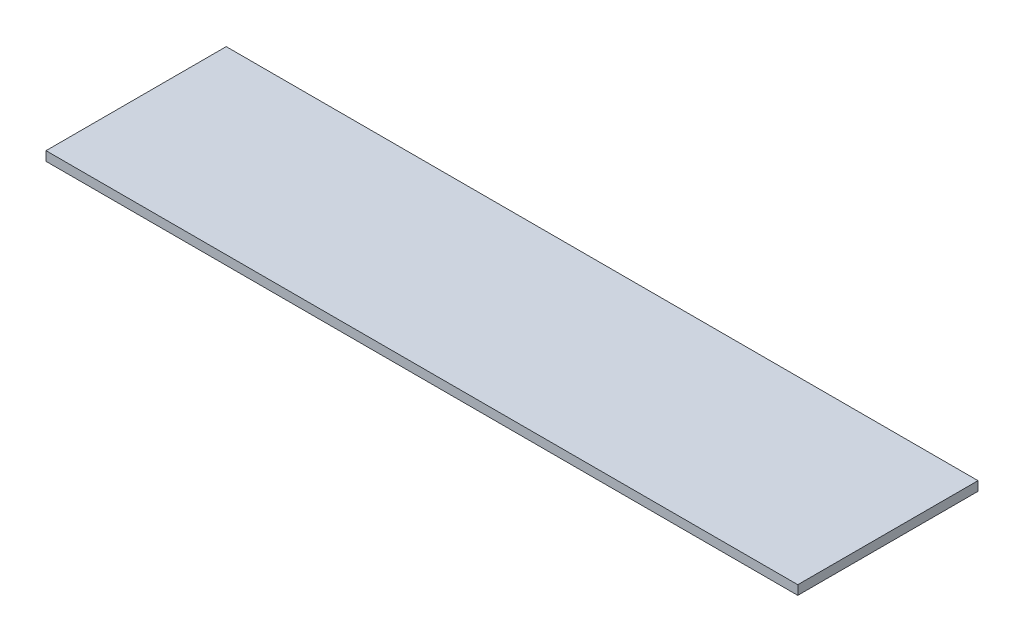
ISO-10303-21;
HEADER;
FILE_DESCRIPTION(('STEP AP214'),'2;1');
FILE_NAME('part.step','',(''),(''),'','','');
FILE_SCHEMA(('AUTOMOTIVE_DESIGN { 1 0 10303 214 1 1 1 1 }'));
ENDSEC;
DATA;
#1=APPLICATION_CONTEXT('core data for automotive mechanical design processes');
#2=APPLICATION_PROTOCOL_DEFINITION('international standard','automotive_design',2000,#1);
#3=PRODUCT_CONTEXT('',#1,'mechanical');
#4=PRODUCT('Part','Part','',(#3));
#5=PRODUCT_RELATED_PRODUCT_CATEGORY('part','',(#4));
#6=PRODUCT_DEFINITION_FORMATION('','',#4);
#7=PRODUCT_DEFINITION_CONTEXT('part definition',#1,'design');
#8=PRODUCT_DEFINITION('design','',#6,#7);
#9=PRODUCT_DEFINITION_SHAPE('','',#8);
#10=(LENGTH_UNIT() NAMED_UNIT(*) SI_UNIT(.MILLI.,.METRE.));
#11=(NAMED_UNIT(*) PLANE_ANGLE_UNIT() SI_UNIT($,.RADIAN.));
#12=(NAMED_UNIT(*) SI_UNIT($,.STERADIAN.) SOLID_ANGLE_UNIT());
#13=UNCERTAINTY_MEASURE_WITH_UNIT(LENGTH_MEASURE(1.E-05),#10,'distance_accuracy_value','');
#14=(GEOMETRIC_REPRESENTATION_CONTEXT(3) GLOBAL_UNCERTAINTY_ASSIGNED_CONTEXT((#13)) GLOBAL_UNIT_ASSIGNED_CONTEXT((#10,
#11,#12)) REPRESENTATION_CONTEXT('',''));
#15=CARTESIAN_POINT('',(0.,0.,0.));
#16=DIRECTION('',(0.,0.,1.));
#17=DIRECTION('',(1.,0.,0.));
#18=AXIS2_PLACEMENT_3D('',#15,#16,#17);
#19=CARTESIAN_POINT('',(730.,18.,-175.));
#20=DIRECTION('',(-1.,0.,0.));
#21=DIRECTION('',(0.,0.,1.));
#22=AXIS2_PLACEMENT_3D('',#19,#20,#21);
#23=PLANE('',#22);
#24=DIRECTION('',(0.,0.,-1.));
#25=VECTOR('',#24,1.);
#26=CARTESIAN_POINT('',(730.,0.,-175.));
#27=LINE('',#26,#25);
#28=CARTESIAN_POINT('',(730.,0.,175.));
#29=VERTEX_POINT('',#28);
#30=CARTESIAN_POINT('',(730.,0.,-175.));
#31=VERTEX_POINT('',#30);
#32=EDGE_CURVE('E97',#29,#31,#27,.T.);
#33=ORIENTED_EDGE('',*,*,#32,.T.);
#34=DIRECTION('',(0.,-1.,0.));
#35=VECTOR('',#34,1.);
#36=CARTESIAN_POINT('',(730.,18.,-175.));
#37=LINE('',#36,#35);
#38=CARTESIAN_POINT('',(730.,18.,-175.));
#39=VERTEX_POINT('',#38);
#40=EDGE_CURVE('E11',#39,#31,#37,.T.);
#41=ORIENTED_EDGE('',*,*,#40,.F.);
#42=DIRECTION('',(0.,0.,-1.));
#43=VECTOR('',#42,1.);
#44=CARTESIAN_POINT('',(730.,18.,-175.));
#45=LINE('',#44,#43);
#46=CARTESIAN_POINT('',(730.,18.,175.));
#47=VERTEX_POINT('',#46);
#48=EDGE_CURVE('E85',#47,#39,#45,.T.);
#49=ORIENTED_EDGE('',*,*,#48,.F.);
#50=DIRECTION('',(0.,-1.,0.));
#51=VECTOR('',#50,1.);
#52=CARTESIAN_POINT('',(730.,18.,175.));
#53=LINE('',#52,#51);
#54=EDGE_CURVE('E93',#47,#29,#53,.T.);
#55=ORIENTED_EDGE('',*,*,#54,.T.);
#56=EDGE_LOOP('',(#33,#41,#49,#55));
#57=FACE_BOUND('',#56,.T.);
#58=ADVANCED_FACE('F34',(#57),#23,.F.);
#59=CARTESIAN_POINT('',(-730.,18.,-175.));
#60=DIRECTION('',(0.,0.,1.));
#61=DIRECTION('',(1.,0.,0.));
#62=AXIS2_PLACEMENT_3D('',#59,#60,#61);
#63=PLANE('',#62);
#64=DIRECTION('',(-1.,0.,0.));
#65=VECTOR('',#64,1.);
#66=CARTESIAN_POINT('',(-730.,0.,-175.));
#67=LINE('',#66,#65);
#68=CARTESIAN_POINT('',(-730.,0.,-175.));
#69=VERTEX_POINT('',#68);
#70=EDGE_CURVE('E89',#31,#69,#67,.T.);
#71=ORIENTED_EDGE('',*,*,#70,.T.);
#72=DIRECTION('',(0.,-1.,0.));
#73=VECTOR('',#72,1.);
#74=CARTESIAN_POINT('',(-730.,18.,-175.));
#75=LINE('',#74,#73);
#76=CARTESIAN_POINT('',(-730.,18.,-175.));
#77=VERTEX_POINT('',#76);
#78=EDGE_CURVE('E42',#77,#69,#75,.T.);
#79=ORIENTED_EDGE('',*,*,#78,.F.);
#80=DIRECTION('',(-1.,0.,0.));
#81=VECTOR('',#80,1.);
#82=CARTESIAN_POINT('',(-730.,18.,-175.));
#83=LINE('',#82,#81);
#84=EDGE_CURVE('E80',#39,#77,#83,.T.);
#85=ORIENTED_EDGE('',*,*,#84,.F.);
#86=ORIENTED_EDGE('',*,*,#40,.T.);
#87=EDGE_LOOP('',(#71,#79,#85,#86));
#88=FACE_BOUND('',#87,.T.);
#89=ADVANCED_FACE('F88',(#88),#63,.F.);
#90=CARTESIAN_POINT('',(-730.,18.,-175.));
#91=DIRECTION('',(1.,0.,0.));
#92=DIRECTION('',(0.,0.,-1.));
#93=AXIS2_PLACEMENT_3D('',#90,#91,#92);
#94=PLANE('',#93);
#95=DIRECTION('',(0.,0.,1.));
#96=VECTOR('',#95,1.);
#97=CARTESIAN_POINT('',(-730.,0.,-175.));
#98=LINE('',#97,#96);
#99=CARTESIAN_POINT('',(-730.,0.,175.));
#100=VERTEX_POINT('',#99);
#101=EDGE_CURVE('E67',#69,#100,#98,.T.);
#102=ORIENTED_EDGE('',*,*,#101,.T.);
#103=DIRECTION('',(0.,-1.,0.));
#104=VECTOR('',#103,1.);
#105=CARTESIAN_POINT('',(-730.,18.,175.));
#106=LINE('',#105,#104);
#107=CARTESIAN_POINT('',(-730.,18.,175.));
#108=VERTEX_POINT('',#107);
#109=EDGE_CURVE('E90',#108,#100,#106,.T.);
#110=ORIENTED_EDGE('',*,*,#109,.F.);
#111=DIRECTION('',(0.,0.,1.));
#112=VECTOR('',#111,1.);
#113=CARTESIAN_POINT('',(-730.,18.,-175.));
#114=LINE('',#113,#112);
#115=EDGE_CURVE('E83',#77,#108,#114,.T.);
#116=ORIENTED_EDGE('',*,*,#115,.F.);
#117=ORIENTED_EDGE('',*,*,#78,.T.);
#118=EDGE_LOOP('',(#102,#110,#116,#117));
#119=FACE_BOUND('',#118,.T.);
#120=ADVANCED_FACE('F91',(#119),#94,.F.);
#121=CARTESIAN_POINT('',(-730.,18.,175.));
#122=DIRECTION('',(0.,0.,-1.));
#123=DIRECTION('',(-1.,0.,0.));
#124=AXIS2_PLACEMENT_3D('',#121,#122,#123);
#125=PLANE('',#124);
#126=DIRECTION('',(1.,0.,0.));
#127=VECTOR('',#126,1.);
#128=CARTESIAN_POINT('',(-730.,0.,175.));
#129=LINE('',#128,#127);
#130=EDGE_CURVE('E73',#100,#29,#129,.T.);
#131=ORIENTED_EDGE('',*,*,#130,.T.);
#132=ORIENTED_EDGE('',*,*,#54,.F.);
#133=DIRECTION('',(1.,0.,0.));
#134=VECTOR('',#133,1.);
#135=CARTESIAN_POINT('',(-730.,18.,175.));
#136=LINE('',#135,#134);
#137=EDGE_CURVE('E50',#108,#47,#136,.T.);
#138=ORIENTED_EDGE('',*,*,#137,.F.);
#139=ORIENTED_EDGE('',*,*,#109,.T.);
#140=EDGE_LOOP('',(#131,#132,#138,#139));
#141=FACE_BOUND('',#140,.T.);
#142=ADVANCED_FACE('F104',(#141),#125,.F.);
#143=CARTESIAN_POINT('',(0.,18.,0.));
#144=DIRECTION('',(0.,1.,0.));
#145=DIRECTION('',(0.,0.,1.));
#146=AXIS2_PLACEMENT_3D('',#143,#144,#145);
#147=PLANE('',#146);
#148=ORIENTED_EDGE('',*,*,#48,.T.);
#149=ORIENTED_EDGE('',*,*,#84,.T.);
#150=ORIENTED_EDGE('',*,*,#115,.T.);
#151=ORIENTED_EDGE('',*,*,#137,.T.);
#152=EDGE_LOOP('',(#148,#149,#150,#151));
#153=FACE_BOUND('',#152,.T.);
#154=ADVANCED_FACE('F81',(#153),#147,.T.);
#155=CARTESIAN_POINT('',(0.,0.,0.));
#156=DIRECTION('',(0.,1.,0.));
#157=DIRECTION('',(0.,0.,1.));
#158=AXIS2_PLACEMENT_3D('',#155,#156,#157);
#159=PLANE('',#158);
#160=ORIENTED_EDGE('',*,*,#32,.F.);
#161=ORIENTED_EDGE('',*,*,#130,.F.);
#162=ORIENTED_EDGE('',*,*,#101,.F.);
#163=ORIENTED_EDGE('',*,*,#70,.F.);
#164=EDGE_LOOP('',(#160,#161,#162,#163));
#165=FACE_BOUND('',#164,.T.);
#166=ADVANCED_FACE('F107',(#165),#159,.F.);
#167=CLOSED_SHELL('',(#58,#89,#120,#142,#154,#166));
#168=MANIFOLD_SOLID_BREP('B2',#167);
#169=ADVANCED_BREP_SHAPE_REPRESENTATION('',(#18,#168),#14);
#170=SHAPE_DEFINITION_REPRESENTATION(#9,#169);
ENDSEC;
END-ISO-10303-21;
